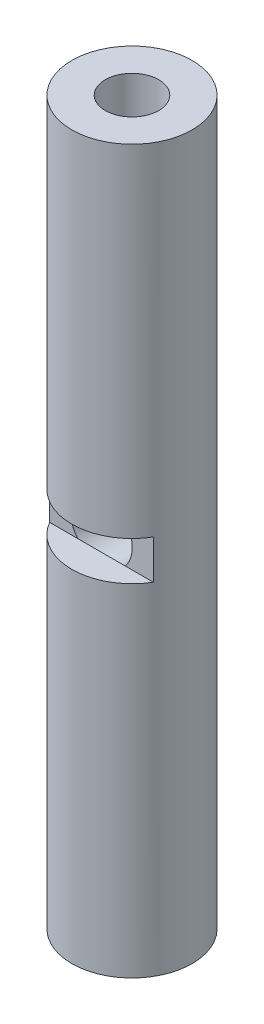
ISO-10303-21;
HEADER;
FILE_DESCRIPTION(('STEP AP214'),'2;1');
FILE_NAME('part.step','',(''),(''),'','','');
FILE_SCHEMA(('AUTOMOTIVE_DESIGN { 1 0 10303 214 1 1 1 1 }'));
ENDSEC;
DATA;
#1=APPLICATION_CONTEXT('core data for automotive mechanical design processes');
#2=APPLICATION_PROTOCOL_DEFINITION('international standard','automotive_design',2000,#1);
#3=PRODUCT_CONTEXT('',#1,'mechanical');
#4=PRODUCT('Part','Part','',(#3));
#5=PRODUCT_RELATED_PRODUCT_CATEGORY('part','',(#4));
#6=PRODUCT_DEFINITION_FORMATION('','',#4);
#7=PRODUCT_DEFINITION_CONTEXT('part definition',#1,'design');
#8=PRODUCT_DEFINITION('design','',#6,#7);
#9=PRODUCT_DEFINITION_SHAPE('','',#8);
#10=(LENGTH_UNIT() NAMED_UNIT(*) SI_UNIT(.MILLI.,.METRE.));
#11=(NAMED_UNIT(*) PLANE_ANGLE_UNIT() SI_UNIT($,.RADIAN.));
#12=(NAMED_UNIT(*) SI_UNIT($,.STERADIAN.) SOLID_ANGLE_UNIT());
#13=UNCERTAINTY_MEASURE_WITH_UNIT(LENGTH_MEASURE(1.E-05),#10,'distance_accuracy_value','');
#14=(GEOMETRIC_REPRESENTATION_CONTEXT(3) GLOBAL_UNCERTAINTY_ASSIGNED_CONTEXT((#13)) GLOBAL_UNIT_ASSIGNED_CONTEXT((#10,
#11,#12)) REPRESENTATION_CONTEXT('',''));
#15=CARTESIAN_POINT('',(0.,0.,0.));
#16=DIRECTION('',(0.,0.,1.));
#17=DIRECTION('',(1.,0.,0.));
#18=AXIS2_PLACEMENT_3D('',#15,#16,#17);
#19=CARTESIAN_POINT('',(0.,0.,1.016));
#20=DIRECTION('',(0.,0.,1.));
#21=DIRECTION('',(1.,0.,0.));
#22=AXIS2_PLACEMENT_3D('',#19,#20,#21);
#23=PLANE('',#22);
#24=DIRECTION('',(1.,0.,0.));
#25=VECTOR('',#24,1.);
#26=CARTESIAN_POINT('',(2.,0.65,1.016));
#27=LINE('',#26,#25);
#28=CARTESIAN_POINT('',(-0.792543374207368,0.65,1.016));
#29=VERTEX_POINT('',#28);
#30=CARTESIAN_POINT('',(0.792543374207368,0.65,1.016));
#31=VERTEX_POINT('',#30);
#32=EDGE_CURVE('E107',#29,#31,#27,.T.);
#33=ORIENTED_EDGE('',*,*,#32,.F.);
#34=CARTESIAN_POINT('',(0.,0.,1.016));
#35=DIRECTION('',(0.,0.,1.));
#36=DIRECTION('',(1.,0.,0.));
#37=AXIS2_PLACEMENT_3D('',#34,#35,#36);
#38=CIRCLE('',#37,1.025);
#39=EDGE_CURVE('E112',#31,#29,#38,.T.);
#40=ORIENTED_EDGE('',*,*,#39,.F.);
#41=EDGE_LOOP('',(#33,#40));
#42=FACE_BOUND('',#41,.T.);
#43=ADVANCED_FACE('F36',(#42),#23,.F.);
#44=DIRECTION('',(-1.,0.,0.));
#45=VECTOR('',#44,1.);
#46=CARTESIAN_POINT('',(2.,-0.65,1.016));
#47=LINE('',#46,#45);
#48=CARTESIAN_POINT('',(0.792543374207368,-0.65,1.016));
#49=VERTEX_POINT('',#48);
#50=CARTESIAN_POINT('',(-0.792543374207368,-0.65,1.016));
#51=VERTEX_POINT('',#50);
#52=EDGE_CURVE('E111',#49,#51,#47,.T.);
#53=ORIENTED_EDGE('',*,*,#52,.F.);
#54=EDGE_CURVE('E116',#51,#49,#38,.T.);
#55=ORIENTED_EDGE('',*,*,#54,.F.);
#56=EDGE_LOOP('',(#53,#55));
#57=FACE_BOUND('',#56,.T.);
#58=ADVANCED_FACE('F150',(#57),#23,.F.);
#59=CARTESIAN_POINT('',(0.,12.,0.));
#60=DIRECTION('',(0.,-1.,0.));
#61=DIRECTION('',(0.,0.,-1.));
#62=AXIS2_PLACEMENT_3D('',#59,#60,#61);
#63=CYLINDRICAL_SURFACE('',#62,2.);
#64=CARTESIAN_POINT('',(0.,0.65,0.));
#65=DIRECTION('',(0.,1.,0.));
#66=DIRECTION('',(0.,0.,1.));
#67=AXIS2_PLACEMENT_3D('',#64,#65,#66);
#68=CIRCLE('',#67,2.);
#69=CARTESIAN_POINT('',(-1.72271413763282,0.65,1.016));
#70=VERTEX_POINT('',#69);
#71=CARTESIAN_POINT('',(1.72271413763282,0.65,1.016));
#72=VERTEX_POINT('',#71);
#73=EDGE_CURVE('E173',#70,#72,#68,.T.);
#74=ORIENTED_EDGE('',*,*,#73,.T.);
#75=DIRECTION('',(0.,-1.,0.));
#76=VECTOR('',#75,1.);
#77=CARTESIAN_POINT('',(1.72271413763282,12.,1.016));
#78=LINE('',#77,#76);
#79=CARTESIAN_POINT('',(1.72271413763282,-0.65,1.016));
#80=VERTEX_POINT('',#79);
#81=EDGE_CURVE('E11',#72,#80,#78,.T.);
#82=ORIENTED_EDGE('',*,*,#81,.T.);
#83=CARTESIAN_POINT('',(0.,-0.65,0.));
#84=DIRECTION('',(0.,-1.,0.));
#85=DIRECTION('',(0.,0.,-1.));
#86=AXIS2_PLACEMENT_3D('',#83,#84,#85);
#87=CIRCLE('',#86,2.);
#88=CARTESIAN_POINT('',(-1.72271413763282,-0.65,1.016));
#89=VERTEX_POINT('',#88);
#90=EDGE_CURVE('E45',#80,#89,#87,.T.);
#91=ORIENTED_EDGE('',*,*,#90,.T.);
#92=DIRECTION('',(0.,-1.,0.));
#93=VECTOR('',#92,1.);
#94=CARTESIAN_POINT('',(-1.72271413763282,12.,1.016));
#95=LINE('',#94,#93);
#96=EDGE_CURVE('E121',#89,#70,#95,.F.);
#97=ORIENTED_EDGE('',*,*,#96,.T.);
#98=EDGE_LOOP('',(#74,#82,#91,#97));
#99=FACE_BOUND('',#98,.T.);
#100=CARTESIAN_POINT('',(0.,1.025,-2.));
#101=CARTESIAN_POINT('',(-0.053723351297364,1.02499653729953,-1.99999696204693));
#102=CARTESIAN_POINT('',(-0.107505847827163,1.02075154609016,-1.99781240341601));
#103=CARTESIAN_POINT('',(-0.213470988087865,1.00396421234739,-1.98928853728325));
#104=CARTESIAN_POINT('',(-0.265650626697519,0.991407174195891,-1.98294187140125));
#105=CARTESIAN_POINT('',(-0.366717556687312,0.958621165097075,-1.96675565062581));
#106=CARTESIAN_POINT('',(-0.415616964339141,0.93842249365117,-1.95692990023119));
#107=CARTESIAN_POINT('',(-0.509254677017657,0.891089038627012,-1.93467805110018));
#108=CARTESIAN_POINT('',(-0.553993176244769,0.863954578981833,-1.92225207381121));
#109=CARTESIAN_POINT('',(-0.641190066990649,0.801592672717169,-1.89501720024865));
#110=CARTESIAN_POINT('',(-0.683330222846899,0.765964830450873,-1.8801078086314));
#111=CARTESIAN_POINT('',(-0.761332717259831,0.68849348605108,-1.84989875907261));
#112=CARTESIAN_POINT('',(-0.797190010499444,0.646645037983135,-1.83459879868562));
#113=CARTESIAN_POINT('',(-0.864581638062411,0.553786320860238,-1.80387940292924));
#114=CARTESIAN_POINT('',(-0.895515094212916,0.502304992836513,-1.78855428859405));
#115=CARTESIAN_POINT('',(-0.948155080345542,0.394009849905672,-1.76121757488033));
#116=CARTESIAN_POINT('',(-0.969868429881207,0.337200014277169,-1.74920352882193));
#117=CARTESIAN_POINT('',(-1.00200020790315,0.223378533812615,-1.73098824786985));
#118=CARTESIAN_POINT('',(-1.01302725109789,0.166590935316563,-1.7244769246411));
#119=CARTESIAN_POINT('',(-1.02532492997108,0.0516300617311416,-1.71719714076279));
#120=CARTESIAN_POINT('',(-1.02660612482858,-0.00654164514672546,-1.71642246474359));
#121=CARTESIAN_POINT('',(-1.01982111640247,-0.11465143034191,-1.72045664037282));
#122=CARTESIAN_POINT('',(-1.0129233787689,-0.164695467259876,-1.72456767835926));
#123=CARTESIAN_POINT('',(-0.992011122443253,-0.262782773697561,-1.73668031204481));
#124=CARTESIAN_POINT('',(-0.977994135052313,-0.31082534292341,-1.74468325727594));
#125=CARTESIAN_POINT('',(-0.94299845134002,-0.404918262398621,-1.7638474238829));
#126=CARTESIAN_POINT('',(-0.921866277340947,-0.450896861774714,-1.77507739361172));
#127=CARTESIAN_POINT('',(-0.873360563486496,-0.538881190245296,-1.79943804060741));
#128=CARTESIAN_POINT('',(-0.845984219305084,-0.580885122243517,-1.81256957091577));
#129=CARTESIAN_POINT('',(-0.781490541041707,-0.665658314158242,-1.84137966375795));
#130=CARTESIAN_POINT('',(-0.743559207728125,-0.707774697834973,-1.85716362682903));
#131=CARTESIAN_POINT('',(-0.661126692145504,-0.785328622119731,-1.88808102811331));
#132=CARTESIAN_POINT('',(-0.616622081694826,-0.820762655572264,-1.90321412152662));
#133=CARTESIAN_POINT('',(-0.519439922436255,-0.885657947485516,-1.9320654108609));
#134=CARTESIAN_POINT('',(-0.466461049081454,-0.914721740569326,-1.94567187290569));
#135=CARTESIAN_POINT('',(-0.355493547157117,-0.963280031091378,-1.96896612554688));
#136=CARTESIAN_POINT('',(-0.297509130313583,-0.982782483019257,-1.9786571723602));
#137=CARTESIAN_POINT('',(-0.183491978077318,-1.00999578336506,-1.99232053190688));
#138=CARTESIAN_POINT('',(-0.127716632448084,-1.01857264724426,-1.99671114509716));
#139=CARTESIAN_POINT('',(-0.0153545364734074,-1.02642873294731,-2.00072936687186));
#140=CARTESIAN_POINT('',(0.0412317849044408,-1.02571270122707,-2.00035940697591));
#141=CARTESIAN_POINT('',(0.148648727071312,-1.01547962567145,-1.99513374428234));
#142=CARTESIAN_POINT('',(0.199569686108775,-1.00669195633095,-1.99064982659309));
#143=CARTESIAN_POINT('',(0.299104156994378,-0.981730634169823,-1.97814399503579));
#144=CARTESIAN_POINT('',(0.347717419412788,-0.965556184939154,-1.97012169967864));
#145=CARTESIAN_POINT('',(0.44281024146994,-0.925889834615258,-1.95098373813062));
#146=CARTESIAN_POINT('',(0.489194761777718,-0.902209472621199,-1.93978929271969));
#147=CARTESIAN_POINT('',(0.577478783096601,-0.848421142623401,-1.91536408315121));
#148=CARTESIAN_POINT('',(0.619376411861238,-0.818310507027374,-1.90213247451629));
#149=CARTESIAN_POINT('',(0.702029518196699,-0.748984520865714,-1.87330183771245));
#150=CARTESIAN_POINT('',(0.742233716905907,-0.709154104470181,-1.85759895608989));
#151=CARTESIAN_POINT('',(0.815649867936075,-0.623324315731355,-1.82655613673284));
#152=CARTESIAN_POINT('',(0.848856375480058,-0.577320184951985,-1.81121648980137));
#153=CARTESIAN_POINT('',(0.909081320077095,-0.477271986592013,-1.78178482689717));
#154=CARTESIAN_POINT('',(0.935657038961176,-0.422924304413589,-1.76780840727634));
#155=CARTESIAN_POINT('',(0.97900299159638,-0.309589856845488,-1.7441820468462));
#156=CARTESIAN_POINT('',(0.995786438005385,-0.250609464913575,-1.73452628032582));
#157=CARTESIAN_POINT('',(1.01747508345641,-0.135801895150254,-1.72188505222155));
#158=CARTESIAN_POINT('',(1.02337684673839,-0.0802260085503565,-1.7183421482934));
#159=CARTESIAN_POINT('',(1.02603710808437,0.0312112542537231,-1.71675645862078));
#160=CARTESIAN_POINT('',(1.02280029476606,0.0870724693880401,-1.7187108524431));
#161=CARTESIAN_POINT('',(1.00821812013217,0.19130957733629,-1.72729650224493));
#162=CARTESIAN_POINT('',(0.997756951368739,0.239856949764276,-1.73341681393078));
#163=CARTESIAN_POINT('',(0.970156022944975,0.334441340688008,-1.7490131601848));
#164=CARTESIAN_POINT('',(0.953014017737528,0.380477509186635,-1.75849032295216));
#165=CARTESIAN_POINT('',(0.911269447650277,0.472140750756265,-1.7804995247419));
#166=CARTESIAN_POINT('',(0.886245793134768,0.517536064913779,-1.79319306880911));
#167=CARTESIAN_POINT('',(0.829895510274182,0.603784152316523,-1.81995777587156));
#168=CARTESIAN_POINT('',(0.798565529721116,0.644634491614111,-1.83402966949505));
#169=CARTESIAN_POINT('',(0.725725442034256,0.72616136429161,-1.86415361259118));
#170=CARTESIAN_POINT('',(0.683421458584716,0.766125268752845,-1.88022531965124));
#171=CARTESIAN_POINT('',(0.592297653559999,0.838568080732544,-1.91088807247991));
#172=CARTESIAN_POINT('',(0.543474114999636,0.871042689370909,-1.92547826517872));
#173=CARTESIAN_POINT('',(0.439687094037733,0.927816560489313,-1.95181389343253));
#174=CARTESIAN_POINT('',(0.384652458951989,0.952004823657122,-1.96352015604513));
#175=CARTESIAN_POINT('',(0.270578978462122,0.990460585233419,-1.98244891329457));
#176=CARTESIAN_POINT('',(0.211551785316461,1.0047556925641,-1.98968387992314));
#177=CARTESIAN_POINT('',(0.126565350512639,1.01747324385465,-1.99615116766132));
#178=CARTESIAN_POINT('',(0.101361414733775,1.02029133243141,-1.997590289974));
#179=CARTESIAN_POINT('',(0.0507760607948114,1.02405555313623,-1.99951543649189));
#180=CARTESIAN_POINT('',(0.0253946380562026,1.02500163679336,-2.00000143601835));
#181=CARTESIAN_POINT('',(0.,1.025,-2.));
#182=B_SPLINE_CURVE_WITH_KNOTS('',3,(#100,#101,#102,#103,#104,#105,#106,#107,#108,#109,#110,
#111,#112,#113,#114,#115,#116,#117,#118,#119,#120,#121,#122,#123,#124,#125,#126,#127,#128,#129,
#130,#131,#132,#133,#134,#135,#136,#137,#138,#139,#140,#141,#142,#143,#144,#145,#146,#147,#148,
#149,#150,#151,#152,#153,#154,#155,#156,#157,#158,#159,#160,#161,#162,#163,#164,#165,#166,#167,
#168,#169,#170,#171,#172,#173,#174,#175,#176,#177,#178,#179,#180,#181),.UNSPECIFIED.,.T.,.F.,(4,
2,2,2,2,2,2,2,2,2,2,2,2,2,2,2,2,2,2,2,2,2,2,2,2,2,2,2,2,2,2,2,2,2,2,2,2,2,2,2,4),(0.,
0.161067244543158,0.32242001771899,0.483139611742621,0.643851700796254,0.814628066745929,
0.98554094864887,1.17055715363499,1.35543627398188,1.52902878801707,1.70243319571123,
1.85377660056098,2.00517252170823,2.16006908893629,2.31503535938719,2.49078493819264,
2.66662650201013,2.85144863664759,3.03611674779643,3.204986974368,3.37377095187759,
3.52866019843194,3.68356614840588,3.84271907111068,4.00193814694447,4.17737909747914,
4.35295605549552,4.53822406194333,4.72324150572658,4.89026309954521,5.05719901721236,
5.20666158280106,5.35617442878372,5.51565207296065,5.67521471445009,5.85551552358353,
6.03591956979645,6.21865349507978,6.40087538409972,6.47700872977742,6.55314404671331),.UNSPECIFIED.);
#183=CARTESIAN_POINT('',(0.,1.025,-2.));
#184=VERTEX_POINT('',#183);
#185=EDGE_CURVE('E115',#184,#184,#182,.T.);
#186=ORIENTED_EDGE('',*,*,#185,.T.);
#187=EDGE_LOOP('',(#186));
#188=FACE_BOUND('',#187,.T.);
#189=CARTESIAN_POINT('',(0.,12.,0.));
#190=DIRECTION('',(0.,1.,0.));
#191=DIRECTION('',(0.,0.,1.));
#192=AXIS2_PLACEMENT_3D('',#189,#190,#191);
#193=CIRCLE('',#192,2.);
#194=CARTESIAN_POINT('',(0.,12.,2.));
#195=VERTEX_POINT('',#194);
#196=EDGE_CURVE('E118',#195,#195,#193,.T.);
#197=ORIENTED_EDGE('',*,*,#196,.F.);
#198=EDGE_LOOP('',(#197));
#199=FACE_BOUND('',#198,.T.);
#200=CARTESIAN_POINT('',(0.,-12.,0.));
#201=DIRECTION('',(0.,1.,0.));
#202=DIRECTION('',(0.,0.,1.));
#203=AXIS2_PLACEMENT_3D('',#200,#201,#202);
#204=CIRCLE('',#203,2.);
#205=CARTESIAN_POINT('',(0.,-12.,2.));
#206=VERTEX_POINT('',#205);
#207=EDGE_CURVE('E122',#206,#206,#204,.T.);
#208=ORIENTED_EDGE('',*,*,#207,.T.);
#209=EDGE_LOOP('',(#208));
#210=FACE_BOUND('',#209,.T.);
#211=ADVANCED_FACE('F38',(#99,#188,#199,#210),#63,.T.);
#212=CARTESIAN_POINT('',(0.,12.,0.));
#213=DIRECTION('',(0.,1.,0.));
#214=DIRECTION('',(0.,0.,1.));
#215=AXIS2_PLACEMENT_3D('',#212,#213,#214);
#216=PLANE('',#215);
#217=CARTESIAN_POINT('',(0.,12.,0.));
#218=DIRECTION('',(0.,1.,0.));
#219=DIRECTION('',(0.,0.,1.));
#220=AXIS2_PLACEMENT_3D('',#217,#218,#219);
#221=CIRCLE('',#220,0.888999999999999);
#222=CARTESIAN_POINT('',(0.,12.,0.888999999999999));
#223=VERTEX_POINT('',#222);
#224=EDGE_CURVE('E93',#223,#223,#221,.T.);
#225=ORIENTED_EDGE('',*,*,#224,.F.);
#226=EDGE_LOOP('',(#225));
#227=FACE_BOUND('',#226,.T.);
#228=ORIENTED_EDGE('',*,*,#196,.T.);
#229=EDGE_LOOP('',(#228));
#230=FACE_BOUND('',#229,.T.);
#231=ADVANCED_FACE('F140',(#227,#230),#216,.T.);
#232=CARTESIAN_POINT('',(0.,-12.,0.));
#233=DIRECTION('',(0.,1.,0.));
#234=DIRECTION('',(0.,0.,1.));
#235=AXIS2_PLACEMENT_3D('',#232,#233,#234);
#236=PLANE('',#235);
#237=CARTESIAN_POINT('',(0.,-12.,0.));
#238=DIRECTION('',(0.,-1.,0.));
#239=DIRECTION('',(0.,0.,-1.));
#240=AXIS2_PLACEMENT_3D('',#237,#238,#239);
#241=CIRCLE('',#240,0.888999999999989);
#242=CARTESIAN_POINT('',(0.,-12.,-0.888999999999989));
#243=VERTEX_POINT('',#242);
#244=EDGE_CURVE('E94',#243,#243,#241,.T.);
#245=ORIENTED_EDGE('',*,*,#244,.F.);
#246=EDGE_LOOP('',(#245));
#247=FACE_BOUND('',#246,.T.);
#248=ORIENTED_EDGE('',*,*,#207,.F.);
#249=EDGE_LOOP('',(#248));
#250=FACE_BOUND('',#249,.T.);
#251=ADVANCED_FACE('F137',(#247,#250),#236,.F.);
#252=CARTESIAN_POINT('',(0.,0.,-14.224));
#253=DIRECTION('',(0.,0.,1.));
#254=DIRECTION('',(1.,0.,0.));
#255=AXIS2_PLACEMENT_3D('',#252,#253,#254);
#256=CYLINDRICAL_SURFACE('',#255,1.025);
#257=ORIENTED_EDGE('',*,*,#39,.T.);
#258=EDGE_CURVE('E164',#29,#51,#38,.T.);
#259=ORIENTED_EDGE('',*,*,#258,.T.);
#260=ORIENTED_EDGE('',*,*,#54,.T.);
#261=EDGE_CURVE('E117',#49,#31,#38,.T.);
#262=ORIENTED_EDGE('',*,*,#261,.T.);
#263=EDGE_LOOP('',(#257,#259,#260,#262));
#264=FACE_BOUND('',#263,.T.);
#265=ORIENTED_EDGE('',*,*,#185,.F.);
#266=EDGE_LOOP('',(#265));
#267=FACE_BOUND('',#266,.T.);
#268=ADVANCED_FACE('F131',(#264,#267),#256,.F.);
#269=CARTESIAN_POINT('',(2.,-0.65,16.256));
#270=DIRECTION('',(0.,-1.,0.));
#271=DIRECTION('',(0.,0.,-1.));
#272=AXIS2_PLACEMENT_3D('',#269,#270,#271);
#273=PLANE('',#272);
#274=EDGE_CURVE('E52',#80,#49,#47,.T.);
#275=ORIENTED_EDGE('',*,*,#274,.T.);
#276=ORIENTED_EDGE('',*,*,#52,.T.);
#277=EDGE_CURVE('E108',#51,#89,#47,.T.);
#278=ORIENTED_EDGE('',*,*,#277,.T.);
#279=ORIENTED_EDGE('',*,*,#90,.F.);
#280=EDGE_LOOP('',(#275,#276,#278,#279));
#281=FACE_BOUND('',#280,.T.);
#282=ADVANCED_FACE('F136',(#281),#273,.F.);
#283=CARTESIAN_POINT('',(2.,0.65,16.256));
#284=DIRECTION('',(0.,1.,0.));
#285=DIRECTION('',(0.,0.,1.));
#286=AXIS2_PLACEMENT_3D('',#283,#284,#285);
#287=PLANE('',#286);
#288=EDGE_CURVE('E60',#70,#29,#27,.T.);
#289=ORIENTED_EDGE('',*,*,#288,.T.);
#290=ORIENTED_EDGE('',*,*,#32,.T.);
#291=EDGE_CURVE('E104',#31,#72,#27,.T.);
#292=ORIENTED_EDGE('',*,*,#291,.T.);
#293=ORIENTED_EDGE('',*,*,#73,.F.);
#294=EDGE_LOOP('',(#289,#290,#292,#293));
#295=FACE_BOUND('',#294,.T.);
#296=ADVANCED_FACE('F174',(#295),#287,.F.);
#297=CARTESIAN_POINT('',(0.,0.,1.016));
#298=DIRECTION('',(0.,0.,-1.));
#299=DIRECTION('',(-1.,0.,0.));
#300=AXIS2_PLACEMENT_3D('',#297,#298,#299);
#301=PLANE('',#300);
#302=ORIENTED_EDGE('',*,*,#288,.F.);
#303=ORIENTED_EDGE('',*,*,#96,.F.);
#304=ORIENTED_EDGE('',*,*,#277,.F.);
#305=ORIENTED_EDGE('',*,*,#258,.F.);
#306=EDGE_LOOP('',(#302,#303,#304,#305));
#307=FACE_BOUND('',#306,.T.);
#308=ADVANCED_FACE('F178',(#307),#301,.F.);
#309=ORIENTED_EDGE('',*,*,#274,.F.);
#310=ORIENTED_EDGE('',*,*,#81,.F.);
#311=ORIENTED_EDGE('',*,*,#291,.F.);
#312=ORIENTED_EDGE('',*,*,#261,.F.);
#313=EDGE_LOOP('',(#309,#310,#311,#312));
#314=FACE_BOUND('',#313,.T.);
#315=ADVANCED_FACE('F175',(#314),#301,.F.);
#316=CARTESIAN_POINT('',(0.,3.01602,0.));
#317=DIRECTION('',(0.,1.,0.));
#318=DIRECTION('',(0.,0.,1.));
#319=AXIS2_PLACEMENT_3D('',#316,#317,#318);
#320=CONICAL_SURFACE('',#319,0.888999999999998,1.02974425867665);
#321=CARTESIAN_POINT('',(0.,2.4818549096845,0.));
#322=VERTEX_POINT('',#321);
#323=VERTEX_LOOP('',#322);
#324=FACE_BOUND('',#323,.T.);
#325=CARTESIAN_POINT('',(0.,3.01602,0.));
#326=DIRECTION('',(0.,1.,0.));
#327=DIRECTION('',(0.,0.,1.));
#328=AXIS2_PLACEMENT_3D('',#325,#326,#327);
#329=CIRCLE('',#328,0.888999999999998);
#330=CARTESIAN_POINT('',(0.,3.01602,0.888999999999998));
#331=VERTEX_POINT('',#330);
#332=EDGE_CURVE('E97',#331,#331,#329,.T.);
#333=ORIENTED_EDGE('',*,*,#332,.T.);
#334=EDGE_LOOP('',(#333));
#335=FACE_BOUND('',#334,.T.);
#336=ADVANCED_FACE('F177',(#324,#335),#320,.F.);
#337=CARTESIAN_POINT('',(0.,12.,0.));
#338=DIRECTION('',(0.,1.,0.));
#339=DIRECTION('',(0.,0.,1.));
#340=AXIS2_PLACEMENT_3D('',#337,#338,#339);
#341=CYLINDRICAL_SURFACE('',#340,0.888999999999998);
#342=ORIENTED_EDGE('',*,*,#332,.F.);
#343=EDGE_LOOP('',(#342));
#344=FACE_BOUND('',#343,.T.);
#345=ORIENTED_EDGE('',*,*,#224,.T.);
#346=EDGE_LOOP('',(#345));
#347=FACE_BOUND('',#346,.T.);
#348=ADVANCED_FACE('F87',(#344,#347),#341,.F.);
#349=CARTESIAN_POINT('',(0.,-3.11,0.));
#350=DIRECTION('',(0.,-1.,0.));
#351=DIRECTION('',(0.,0.,-1.));
#352=AXIS2_PLACEMENT_3D('',#349,#350,#351);
#353=CONICAL_SURFACE('',#352,0.888999999999998,1.02974425867665);
#354=CARTESIAN_POINT('',(0.,-2.5758349096845,0.));
#355=VERTEX_POINT('',#354);
#356=VERTEX_LOOP('',#355);
#357=FACE_BOUND('',#356,.T.);
#358=CARTESIAN_POINT('',(0.,-3.11,0.));
#359=DIRECTION('',(0.,-1.,0.));
#360=DIRECTION('',(0.,0.,-1.));
#361=AXIS2_PLACEMENT_3D('',#358,#359,#360);
#362=CIRCLE('',#361,0.888999999999998);
#363=CARTESIAN_POINT('',(0.,-3.11,-0.888999999999998));
#364=VERTEX_POINT('',#363);
#365=EDGE_CURVE('E91',#364,#364,#362,.T.);
#366=ORIENTED_EDGE('',*,*,#365,.T.);
#367=EDGE_LOOP('',(#366));
#368=FACE_BOUND('',#367,.T.);
#369=ADVANCED_FACE('F83',(#357,#368),#353,.F.);
#370=CARTESIAN_POINT('',(0.,-12.,0.));
#371=DIRECTION('',(0.,-1.,0.));
#372=DIRECTION('',(0.,0.,-1.));
#373=AXIS2_PLACEMENT_3D('',#370,#371,#372);
#374=CYLINDRICAL_SURFACE('',#373,0.888999999999993);
#375=ORIENTED_EDGE('',*,*,#365,.F.);
#376=EDGE_LOOP('',(#375));
#377=FACE_BOUND('',#376,.T.);
#378=ORIENTED_EDGE('',*,*,#244,.T.);
#379=EDGE_LOOP('',(#378));
#380=FACE_BOUND('',#379,.T.);
#381=ADVANCED_FACE('F86',(#377,#380),#374,.F.);
#382=CLOSED_SHELL('',(#43,#58,#211,#231,#251,#268,#282,#296,#308,#315,#336,#348,#369,#381));
#383=MANIFOLD_SOLID_BREP('B2',#382);
#384=ADVANCED_BREP_SHAPE_REPRESENTATION('',(#18,#383),#14);
#385=SHAPE_DEFINITION_REPRESENTATION(#9,#384);
ENDSEC;
END-ISO-10303-21;
